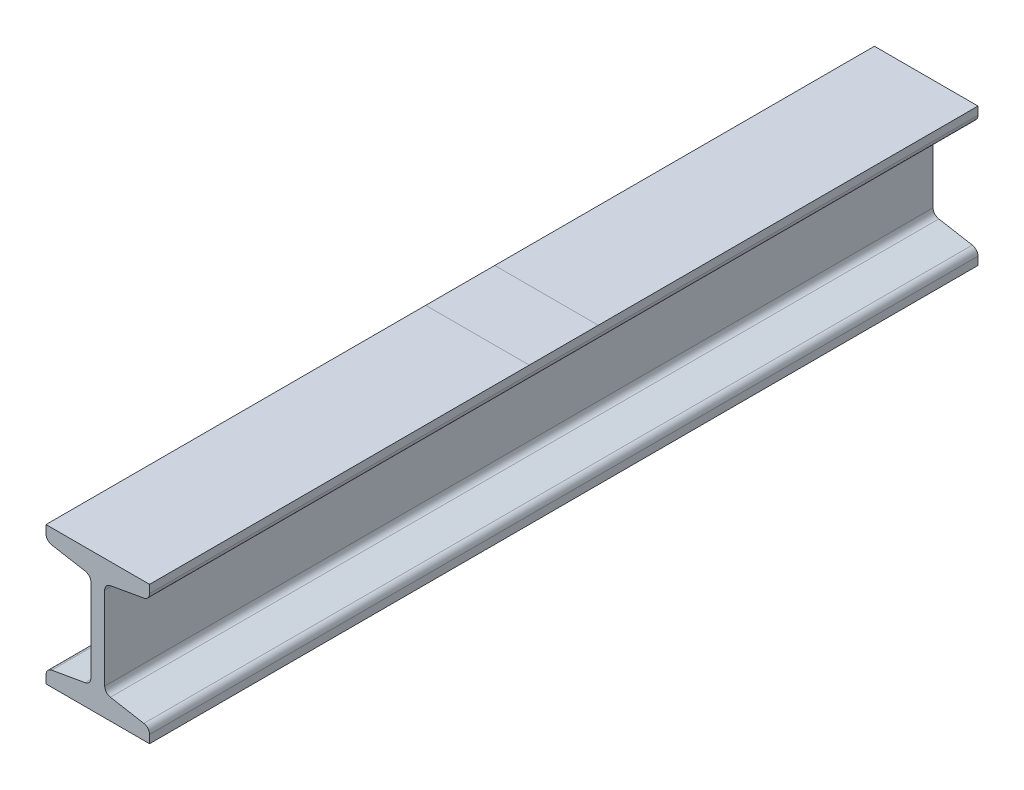
ISO-10303-21;
HEADER;
FILE_DESCRIPTION(('STEP AP214'),'2;1');
FILE_NAME('part.step','',(''),(''),'','','');
FILE_SCHEMA(('AUTOMOTIVE_DESIGN { 1 0 10303 214 1 1 1 1 }'));
ENDSEC;
DATA;
#1=APPLICATION_CONTEXT('core data for automotive mechanical design processes');
#2=APPLICATION_PROTOCOL_DEFINITION('international standard','automotive_design',2000,#1);
#3=PRODUCT_CONTEXT('',#1,'mechanical');
#4=PRODUCT('Part','Part','',(#3));
#5=PRODUCT_RELATED_PRODUCT_CATEGORY('part','',(#4));
#6=PRODUCT_DEFINITION_FORMATION('','',#4);
#7=PRODUCT_DEFINITION_CONTEXT('part definition',#1,'design');
#8=PRODUCT_DEFINITION('design','',#6,#7);
#9=PRODUCT_DEFINITION_SHAPE('','',#8);
#10=(LENGTH_UNIT() NAMED_UNIT(*) SI_UNIT(.MILLI.,.METRE.));
#11=(NAMED_UNIT(*) PLANE_ANGLE_UNIT() SI_UNIT($,.RADIAN.));
#12=(NAMED_UNIT(*) SI_UNIT($,.STERADIAN.) SOLID_ANGLE_UNIT());
#13=UNCERTAINTY_MEASURE_WITH_UNIT(LENGTH_MEASURE(1.E-05),#10,'distance_accuracy_value','');
#14=(GEOMETRIC_REPRESENTATION_CONTEXT(3) GLOBAL_UNCERTAINTY_ASSIGNED_CONTEXT((#13)) GLOBAL_UNIT_ASSIGNED_CONTEXT((#10,
#11,#12)) REPRESENTATION_CONTEXT('',''));
#15=CARTESIAN_POINT('',(0.,0.,0.));
#16=DIRECTION('',(0.,0.,1.));
#17=DIRECTION('',(1.,0.,0.));
#18=AXIS2_PLACEMENT_3D('',#15,#16,#17);
#19=CARTESIAN_POINT('',(-37.5,-50.,600.));
#20=DIRECTION('',(0.,1.,0.));
#21=DIRECTION('',(0.,0.,1.));
#22=AXIS2_PLACEMENT_3D('',#19,#20,#21);
#23=PLANE('',#22);
#24=DIRECTION('',(-1.,0.,0.));
#25=VECTOR('',#24,1.);
#26=CARTESIAN_POINT('',(-37.5000000000003,-50.,40.));
#27=LINE('',#26,#25);
#28=CARTESIAN_POINT('',(37.5,-50.,40.));
#29=VERTEX_POINT('',#28);
#30=CARTESIAN_POINT('',(-37.5,-50.,40.));
#31=VERTEX_POINT('',#30);
#32=EDGE_CURVE('E278',#29,#31,#27,.T.);
#33=ORIENTED_EDGE('',*,*,#32,.F.);
#34=DIRECTION('',(0.,0.,-1.));
#35=VECTOR('',#34,1.);
#36=CARTESIAN_POINT('',(37.5,-50.,600.));
#37=LINE('',#36,#35);
#38=CARTESIAN_POINT('',(37.5,-50.,560.));
#39=VERTEX_POINT('',#38);
#40=EDGE_CURVE('E517',#39,#29,#37,.T.);
#41=ORIENTED_EDGE('',*,*,#40,.F.);
#42=DIRECTION('',(1.,0.,0.));
#43=VECTOR('',#42,1.);
#44=CARTESIAN_POINT('',(-37.5,-50.,560.));
#45=LINE('',#44,#43);
#46=CARTESIAN_POINT('',(-37.5,-50.,560.));
#47=VERTEX_POINT('',#46);
#48=EDGE_CURVE('E284',#47,#39,#45,.T.);
#49=ORIENTED_EDGE('',*,*,#48,.F.);
#50=DIRECTION('',(0.,0.,-1.));
#51=VECTOR('',#50,1.);
#52=CARTESIAN_POINT('',(-37.5,-50.,600.));
#53=LINE('',#52,#51);
#54=EDGE_CURVE('E357',#47,#31,#53,.T.);
#55=ORIENTED_EDGE('',*,*,#54,.T.);
#56=EDGE_LOOP('',(#33,#41,#49,#55));
#57=FACE_BOUND('',#56,.T.);
#58=ADVANCED_FACE('F52',(#57),#23,.F.);
#59=CARTESIAN_POINT('',(37.5,-50.,0.));
#60=VERTEX_POINT('',#59);
#61=EDGE_CURVE('E521',#29,#60,#37,.T.);
#62=ORIENTED_EDGE('',*,*,#61,.F.);
#63=ORIENTED_EDGE('',*,*,#32,.T.);
#64=CARTESIAN_POINT('',(-37.5,-50.,0.));
#65=VERTEX_POINT('',#64);
#66=EDGE_CURVE('E358',#31,#65,#53,.T.);
#67=ORIENTED_EDGE('',*,*,#66,.T.);
#68=DIRECTION('',(1.,0.,0.));
#69=VECTOR('',#68,1.);
#70=CARTESIAN_POINT('',(-37.5,-50.,0.));
#71=LINE('',#70,#69);
#72=EDGE_CURVE('E382',#65,#60,#71,.T.);
#73=ORIENTED_EDGE('',*,*,#72,.T.);
#74=EDGE_LOOP('',(#62,#63,#67,#73));
#75=FACE_BOUND('',#74,.T.);
#76=ADVANCED_FACE('F570',(#75),#23,.F.);
#77=CARTESIAN_POINT('',(-37.5,50.,600.));
#78=DIRECTION('',(0.,-1.,0.));
#79=DIRECTION('',(0.,0.,-1.));
#80=AXIS2_PLACEMENT_3D('',#77,#78,#79);
#81=PLANE('',#80);
#82=DIRECTION('',(-1.,0.,0.));
#83=VECTOR('',#82,1.);
#84=CARTESIAN_POINT('',(-37.5,50.,275.));
#85=LINE('',#84,#83);
#86=CARTESIAN_POINT('',(37.5,50.,275.));
#87=VERTEX_POINT('',#86);
#88=CARTESIAN_POINT('',(-37.5,50.,275.));
#89=VERTEX_POINT('',#88);
#90=EDGE_CURVE('E493',#87,#89,#85,.T.);
#91=ORIENTED_EDGE('',*,*,#90,.F.);
#92=DIRECTION('',(0.,0.,-1.));
#93=VECTOR('',#92,1.);
#94=CARTESIAN_POINT('',(37.5,50.,600.));
#95=LINE('',#94,#93);
#96=CARTESIAN_POINT('',(37.5,50.,0.));
#97=VERTEX_POINT('',#96);
#98=EDGE_CURVE('E241',#87,#97,#95,.T.);
#99=ORIENTED_EDGE('',*,*,#98,.T.);
#100=DIRECTION('',(-1.,0.,0.));
#101=VECTOR('',#100,1.);
#102=CARTESIAN_POINT('',(-37.5,50.,0.));
#103=LINE('',#102,#101);
#104=CARTESIAN_POINT('',(-37.5,50.,0.));
#105=VERTEX_POINT('',#104);
#106=EDGE_CURVE('E418',#97,#105,#103,.T.);
#107=ORIENTED_EDGE('',*,*,#106,.T.);
#108=DIRECTION('',(0.,0.,-1.));
#109=VECTOR('',#108,1.);
#110=CARTESIAN_POINT('',(-37.5,50.,600.));
#111=LINE('',#110,#109);
#112=EDGE_CURVE('E356',#89,#105,#111,.T.);
#113=ORIENTED_EDGE('',*,*,#112,.F.);
#114=EDGE_LOOP('',(#91,#99,#107,#113));
#115=FACE_BOUND('',#114,.T.);
#116=ADVANCED_FACE('F492',(#115),#81,.F.);
#117=DIRECTION('',(1.,0.,0.));
#118=VECTOR('',#117,1.);
#119=CARTESIAN_POINT('',(-37.5,50.,325.));
#120=LINE('',#119,#118);
#121=CARTESIAN_POINT('',(-37.5,50.,325.));
#122=VERTEX_POINT('',#121);
#123=CARTESIAN_POINT('',(37.5,50.,325.));
#124=VERTEX_POINT('',#123);
#125=EDGE_CURVE('E239',#122,#124,#120,.T.);
#126=ORIENTED_EDGE('',*,*,#125,.F.);
#127=CARTESIAN_POINT('',(-37.5,50.,600.));
#128=VERTEX_POINT('',#127);
#129=EDGE_CURVE('E244',#128,#122,#111,.T.);
#130=ORIENTED_EDGE('',*,*,#129,.F.);
#131=DIRECTION('',(-1.,0.,0.));
#132=VECTOR('',#131,1.);
#133=CARTESIAN_POINT('',(-37.5,50.,600.));
#134=LINE('',#133,#132);
#135=CARTESIAN_POINT('',(37.5,50.,600.));
#136=VERTEX_POINT('',#135);
#137=EDGE_CURVE('E219',#136,#128,#134,.T.);
#138=ORIENTED_EDGE('',*,*,#137,.F.);
#139=EDGE_CURVE('E232',#136,#124,#95,.T.);
#140=ORIENTED_EDGE('',*,*,#139,.T.);
#141=EDGE_LOOP('',(#126,#130,#138,#140));
#142=FACE_BOUND('',#141,.T.);
#143=ADVANCED_FACE('F242',(#142),#81,.F.);
#144=CARTESIAN_POINT('',(37.5,40.,600.));
#145=DIRECTION('',(-0.173648177666934,0.984807753012207,0.));
#146=DIRECTION('',(-0.984807753012208,-0.173648177666934,0.));
#147=AXIS2_PLACEMENT_3D('',#144,#145,#146);
#148=PLANE('',#147);
#149=DIRECTION('',(0.984807753012207,0.173648177666934,0.));
#150=VECTOR('',#149,1.);
#151=CARTESIAN_POINT('',(37.5,40.,0.));
#152=LINE('',#151,#150);
#153=CARTESIAN_POINT('',(9.13175911166535,34.9979137361494,0.));
#154=VERTEX_POINT('',#153);
#155=CARTESIAN_POINT('',(33.3682408883347,39.2714593908254,0.));
#156=VERTEX_POINT('',#155);
#157=EDGE_CURVE('E420',#154,#156,#152,.T.);
#158=ORIENTED_EDGE('',*,*,#157,.T.);
#159=DIRECTION('',(0.,0.,-1.));
#160=VECTOR('',#159,1.);
#161=CARTESIAN_POINT('',(33.3682408883347,39.2714593908254,600.));
#162=LINE('',#161,#160);
#163=CARTESIAN_POINT('',(33.3682408883347,39.2714593908254,600.));
#164=VERTEX_POINT('',#163);
#165=EDGE_CURVE('E325',#156,#164,#162,.F.);
#166=ORIENTED_EDGE('',*,*,#165,.T.);
#167=DIRECTION('',(0.984807753012207,0.173648177666934,0.));
#168=VECTOR('',#167,1.);
#169=CARTESIAN_POINT('',(37.5,40.,600.));
#170=LINE('',#169,#168);
#171=CARTESIAN_POINT('',(9.13175911166535,34.9979137361494,600.));
#172=VERTEX_POINT('',#171);
#173=EDGE_CURVE('E228',#172,#164,#170,.T.);
#174=ORIENTED_EDGE('',*,*,#173,.F.);
#175=DIRECTION('',(0.,0.,-1.));
#176=VECTOR('',#175,1.);
#177=CARTESIAN_POINT('',(9.13175911166535,34.9979137361494,0.));
#178=LINE('',#177,#176);
#179=EDGE_CURVE('E321',#172,#154,#178,.T.);
#180=ORIENTED_EDGE('',*,*,#179,.T.);
#181=EDGE_LOOP('',(#158,#166,#174,#180));
#182=FACE_BOUND('',#181,.T.);
#183=ADVANCED_FACE('F600',(#182),#148,.F.);
#184=CARTESIAN_POINT('',(37.5,50.,600.));
#185=DIRECTION('',(-1.,0.,0.));
#186=DIRECTION('',(0.,-1.,0.));
#187=AXIS2_PLACEMENT_3D('',#184,#185,#186);
#188=PLANE('',#187);
#189=DIRECTION('',(0.,1.,0.));
#190=VECTOR('',#189,1.);
#191=CARTESIAN_POINT('',(37.5,50.,600.));
#192=LINE('',#191,#190);
#193=CARTESIAN_POINT('',(37.5,44.1954981558864,600.));
#194=VERTEX_POINT('',#193);
#195=EDGE_CURVE('E213',#194,#136,#192,.T.);
#196=ORIENTED_EDGE('',*,*,#195,.F.);
#197=DIRECTION('',(0.,0.,-1.));
#198=VECTOR('',#197,1.);
#199=CARTESIAN_POINT('',(37.5,44.1954981558864,600.));
#200=LINE('',#199,#198);
#201=CARTESIAN_POINT('',(37.5,44.1954981558864,0.));
#202=VERTEX_POINT('',#201);
#203=EDGE_CURVE('E318',#194,#202,#200,.T.);
#204=ORIENTED_EDGE('',*,*,#203,.T.);
#205=DIRECTION('',(0.,1.,0.));
#206=VECTOR('',#205,1.);
#207=CARTESIAN_POINT('',(37.5,50.,0.));
#208=LINE('',#207,#206);
#209=EDGE_CURVE('E408',#202,#97,#208,.T.);
#210=ORIENTED_EDGE('',*,*,#209,.T.);
#211=ORIENTED_EDGE('',*,*,#98,.F.);
#212=EDGE_CURVE('E236',#124,#87,#95,.T.);
#213=ORIENTED_EDGE('',*,*,#212,.F.);
#214=ORIENTED_EDGE('',*,*,#139,.F.);
#215=EDGE_LOOP('',(#196,#204,#210,#211,#213,#214));
#216=FACE_BOUND('',#215,.T.);
#217=ADVANCED_FACE('F233',(#216),#188,.F.);
#218=ORIENTED_EDGE('',*,*,#212,.T.);
#219=ORIENTED_EDGE('',*,*,#90,.T.);
#220=EDGE_CURVE('E364',#122,#89,#111,.T.);
#221=ORIENTED_EDGE('',*,*,#220,.F.);
#222=ORIENTED_EDGE('',*,*,#125,.T.);
#223=EDGE_LOOP('',(#218,#219,#221,#222));
#224=FACE_BOUND('',#223,.T.);
#225=ADVANCED_FACE('F497',(#224),#81,.F.);
#226=CARTESIAN_POINT('',(-37.5,50.,600.));
#227=DIRECTION('',(1.,0.,0.));
#228=DIRECTION('',(0.,0.,-1.));
#229=AXIS2_PLACEMENT_3D('',#226,#227,#228);
#230=PLANE('',#229);
#231=DIRECTION('',(0.,-1.,0.));
#232=VECTOR('',#231,1.);
#233=CARTESIAN_POINT('',(-37.5,50.,0.));
#234=LINE('',#233,#232);
#235=CARTESIAN_POINT('',(-37.5,44.1954981558864,0.));
#236=VERTEX_POINT('',#235);
#237=EDGE_CURVE('E424',#105,#236,#234,.T.);
#238=ORIENTED_EDGE('',*,*,#237,.T.);
#239=DIRECTION('',(0.,0.,-1.));
#240=VECTOR('',#239,1.);
#241=CARTESIAN_POINT('',(-37.5,44.1954981558864,600.));
#242=LINE('',#241,#240);
#243=CARTESIAN_POINT('',(-37.5,44.1954981558864,600.));
#244=VERTEX_POINT('',#243);
#245=EDGE_CURVE('E335',#236,#244,#242,.F.);
#246=ORIENTED_EDGE('',*,*,#245,.T.);
#247=DIRECTION('',(0.,-1.,0.));
#248=VECTOR('',#247,1.);
#249=CARTESIAN_POINT('',(-37.5,50.,600.));
#250=LINE('',#249,#248);
#251=EDGE_CURVE('E247',#128,#244,#250,.T.);
#252=ORIENTED_EDGE('',*,*,#251,.F.);
#253=ORIENTED_EDGE('',*,*,#129,.T.);
#254=ORIENTED_EDGE('',*,*,#220,.T.);
#255=ORIENTED_EDGE('',*,*,#112,.T.);
#256=EDGE_LOOP('',(#238,#246,#252,#253,#254,#255));
#257=FACE_BOUND('',#256,.T.);
#258=ADVANCED_FACE('F486',(#257),#230,.F.);
#259=CARTESIAN_POINT('',(-37.5,40.,600.));
#260=DIRECTION('',(0.173648177666934,0.984807753012207,0.));
#261=DIRECTION('',(-0.984807753012208,0.173648177666934,0.));
#262=AXIS2_PLACEMENT_3D('',#259,#260,#261);
#263=PLANE('',#262);
#264=DIRECTION('',(0.984807753012207,-0.173648177666934,0.));
#265=VECTOR('',#264,1.);
#266=CARTESIAN_POINT('',(-37.5,40.,600.));
#267=LINE('',#266,#265);
#268=CARTESIAN_POINT('',(-33.3682408883347,39.2714593908254,600.));
#269=VERTEX_POINT('',#268);
#270=CARTESIAN_POINT('',(-9.13175911166534,34.9979137361494,600.));
#271=VERTEX_POINT('',#270);
#272=EDGE_CURVE('E250',#269,#271,#267,.T.);
#273=ORIENTED_EDGE('',*,*,#272,.F.);
#274=DIRECTION('',(0.,0.,-1.));
#275=VECTOR('',#274,1.);
#276=CARTESIAN_POINT('',(-33.3682408883347,39.2714593908254,600.));
#277=LINE('',#276,#275);
#278=CARTESIAN_POINT('',(-33.3682408883347,39.2714593908254,0.));
#279=VERTEX_POINT('',#278);
#280=EDGE_CURVE('E331',#269,#279,#277,.T.);
#281=ORIENTED_EDGE('',*,*,#280,.T.);
#282=DIRECTION('',(0.984807753012207,-0.173648177666934,0.));
#283=VECTOR('',#282,1.);
#284=CARTESIAN_POINT('',(-37.5,40.,0.));
#285=LINE('',#284,#283);
#286=CARTESIAN_POINT('',(-9.13175911166534,34.9979137361494,0.));
#287=VERTEX_POINT('',#286);
#288=EDGE_CURVE('E431',#279,#287,#285,.T.);
#289=ORIENTED_EDGE('',*,*,#288,.T.);
#290=DIRECTION('',(0.,0.,-1.));
#291=VECTOR('',#290,1.);
#292=CARTESIAN_POINT('',(-9.13175911166534,34.9979137361494,600.));
#293=LINE('',#292,#291);
#294=EDGE_CURVE('E328',#287,#271,#293,.F.);
#295=ORIENTED_EDGE('',*,*,#294,.T.);
#296=EDGE_LOOP('',(#273,#281,#289,#295));
#297=FACE_BOUND('',#296,.T.);
#298=ADVANCED_FACE('F479',(#297),#263,.F.);
#299=CARTESIAN_POINT('',(-4.99999999999998,-34.2693731269748,600.));
#300=DIRECTION('',(1.,0.,0.));
#301=DIRECTION('',(0.,1.,0.));
#302=AXIS2_PLACEMENT_3D('',#299,#300,#301);
#303=PLANE('',#302);
#304=DIRECTION('',(0.,-1.,0.));
#305=VECTOR('',#304,1.);
#306=CARTESIAN_POINT('',(-4.99999999999998,-34.2693731269748,0.));
#307=LINE('',#306,#305);
#308=CARTESIAN_POINT('',(-5.,30.0738749710884,0.));
#309=VERTEX_POINT('',#308);
#310=CARTESIAN_POINT('',(-4.99999999999998,-30.0738749710884,0.));
#311=VERTEX_POINT('',#310);
#312=EDGE_CURVE('E378',#309,#311,#307,.T.);
#313=ORIENTED_EDGE('',*,*,#312,.T.);
#314=DIRECTION('',(0.,0.,-1.));
#315=VECTOR('',#314,1.);
#316=CARTESIAN_POINT('',(-4.99999999999998,-30.0738749710884,600.));
#317=LINE('',#316,#315);
#318=CARTESIAN_POINT('',(-4.99999999999998,-30.0738749710884,600.));
#319=VERTEX_POINT('',#318);
#320=EDGE_CURVE('E445',#311,#319,#317,.F.);
#321=ORIENTED_EDGE('',*,*,#320,.T.);
#322=DIRECTION('',(0.,-1.,0.));
#323=VECTOR('',#322,1.);
#324=CARTESIAN_POINT('',(-4.99999999999998,-34.2693731269748,600.));
#325=LINE('',#324,#323);
#326=CARTESIAN_POINT('',(-5.,30.0738749710884,600.));
#327=VERTEX_POINT('',#326);
#328=EDGE_CURVE('E257',#327,#319,#325,.T.);
#329=ORIENTED_EDGE('',*,*,#328,.F.);
#330=DIRECTION('',(0.,0.,-1.));
#331=VECTOR('',#330,1.);
#332=CARTESIAN_POINT('',(-5.,30.0738749710884,0.));
#333=LINE('',#332,#331);
#334=EDGE_CURVE('E447',#327,#309,#333,.T.);
#335=ORIENTED_EDGE('',*,*,#334,.T.);
#336=EDGE_LOOP('',(#313,#321,#329,#335));
#337=FACE_BOUND('',#336,.T.);
#338=ADVANCED_FACE('F443',(#337),#303,.F.);
#339=CARTESIAN_POINT('',(-37.5,-40.,600.));
#340=DIRECTION('',(0.173648177666934,-0.984807753012207,0.));
#341=DIRECTION('',(0.984807753012208,0.173648177666934,0.));
#342=AXIS2_PLACEMENT_3D('',#339,#340,#341);
#343=PLANE('',#342);
#344=DIRECTION('',(-0.984807753012207,-0.173648177666934,0.));
#345=VECTOR('',#344,1.);
#346=CARTESIAN_POINT('',(-37.5,-40.,0.));
#347=LINE('',#346,#345);
#348=CARTESIAN_POINT('',(-9.13175911166532,-34.9979137361494,0.));
#349=VERTEX_POINT('',#348);
#350=CARTESIAN_POINT('',(-33.3682408883347,-39.2714593908254,0.));
#351=VERTEX_POINT('',#350);
#352=EDGE_CURVE('E371',#349,#351,#347,.T.);
#353=ORIENTED_EDGE('',*,*,#352,.T.);
#354=DIRECTION('',(0.,0.,-1.));
#355=VECTOR('',#354,1.);
#356=CARTESIAN_POINT('',(-33.3682408883347,-39.2714593908254,600.));
#357=LINE('',#356,#355);
#358=CARTESIAN_POINT('',(-33.3682408883347,-39.2714593908254,600.));
#359=VERTEX_POINT('',#358);
#360=EDGE_CURVE('E548',#351,#359,#357,.F.);
#361=ORIENTED_EDGE('',*,*,#360,.T.);
#362=DIRECTION('',(-0.984807753012207,-0.173648177666934,0.));
#363=VECTOR('',#362,1.);
#364=CARTESIAN_POINT('',(-37.5,-40.,600.));
#365=LINE('',#364,#363);
#366=CARTESIAN_POINT('',(-9.13175911166532,-34.9979137361494,600.));
#367=VERTEX_POINT('',#366);
#368=EDGE_CURVE('E261',#367,#359,#365,.T.);
#369=ORIENTED_EDGE('',*,*,#368,.F.);
#370=DIRECTION('',(0.,0.,-1.));
#371=VECTOR('',#370,1.);
#372=CARTESIAN_POINT('',(-9.13175911166532,-34.9979137361494,0.));
#373=LINE('',#372,#371);
#374=EDGE_CURVE('E343',#367,#349,#373,.T.);
#375=ORIENTED_EDGE('',*,*,#374,.T.);
#376=EDGE_LOOP('',(#353,#361,#369,#375));
#377=FACE_BOUND('',#376,.T.);
#378=ADVANCED_FACE('F556',(#377),#343,.F.);
#379=CARTESIAN_POINT('',(-37.5,-50.,600.));
#380=DIRECTION('',(1.,0.,0.));
#381=DIRECTION('',(0.,1.,0.));
#382=AXIS2_PLACEMENT_3D('',#379,#380,#381);
#383=PLANE('',#382);
#384=DIRECTION('',(0.,-1.,0.));
#385=VECTOR('',#384,1.);
#386=CARTESIAN_POINT('',(-37.5,-50.,600.));
#387=LINE('',#386,#385);
#388=CARTESIAN_POINT('',(-37.5,-44.1954981558864,600.));
#389=VERTEX_POINT('',#388);
#390=CARTESIAN_POINT('',(-37.5,-50.,600.));
#391=VERTEX_POINT('',#390);
#392=EDGE_CURVE('E265',#389,#391,#387,.T.);
#393=ORIENTED_EDGE('',*,*,#392,.F.);
#394=DIRECTION('',(0.,0.,-1.));
#395=VECTOR('',#394,1.);
#396=CARTESIAN_POINT('',(-37.5,-44.1954981558864,600.));
#397=LINE('',#396,#395);
#398=CARTESIAN_POINT('',(-37.5,-44.1954981558864,0.));
#399=VERTEX_POINT('',#398);
#400=EDGE_CURVE('E338',#389,#399,#397,.T.);
#401=ORIENTED_EDGE('',*,*,#400,.T.);
#402=DIRECTION('',(0.,-1.,0.));
#403=VECTOR('',#402,1.);
#404=CARTESIAN_POINT('',(-37.5,-50.,0.));
#405=LINE('',#404,#403);
#406=EDGE_CURVE('E377',#399,#65,#405,.T.);
#407=ORIENTED_EDGE('',*,*,#406,.T.);
#408=ORIENTED_EDGE('',*,*,#66,.F.);
#409=ORIENTED_EDGE('',*,*,#54,.F.);
#410=EDGE_CURVE('E351',#391,#47,#53,.T.);
#411=ORIENTED_EDGE('',*,*,#410,.F.);
#412=EDGE_LOOP('',(#393,#401,#407,#408,#409,#411));
#413=FACE_BOUND('',#412,.T.);
#414=ADVANCED_FACE('F565',(#413),#383,.F.);
#415=ORIENTED_EDGE('',*,*,#410,.T.);
#416=ORIENTED_EDGE('',*,*,#48,.T.);
#417=CARTESIAN_POINT('',(37.5,-50.,600.));
#418=VERTEX_POINT('',#417);
#419=EDGE_CURVE('E359',#418,#39,#37,.T.);
#420=ORIENTED_EDGE('',*,*,#419,.F.);
#421=DIRECTION('',(1.,0.,0.));
#422=VECTOR('',#421,1.);
#423=CARTESIAN_POINT('',(-37.5,-50.,600.));
#424=LINE('',#423,#422);
#425=EDGE_CURVE('E268',#391,#418,#424,.T.);
#426=ORIENTED_EDGE('',*,*,#425,.F.);
#427=EDGE_LOOP('',(#415,#416,#420,#426));
#428=FACE_BOUND('',#427,.T.);
#429=ADVANCED_FACE('F508',(#428),#23,.F.);
#430=CARTESIAN_POINT('',(37.5,-50.,600.));
#431=DIRECTION('',(-1.,0.,0.));
#432=DIRECTION('',(0.,-1.,0.));
#433=AXIS2_PLACEMENT_3D('',#430,#431,#432);
#434=PLANE('',#433);
#435=DIRECTION('',(0.,1.,0.));
#436=VECTOR('',#435,1.);
#437=CARTESIAN_POINT('',(37.5,-50.,0.));
#438=LINE('',#437,#436);
#439=CARTESIAN_POINT('',(37.5,-44.1954981558864,0.));
#440=VERTEX_POINT('',#439);
#441=EDGE_CURVE('E387',#60,#440,#438,.T.);
#442=ORIENTED_EDGE('',*,*,#441,.T.);
#443=DIRECTION('',(0.,0.,-1.));
#444=VECTOR('',#443,1.);
#445=CARTESIAN_POINT('',(37.5,-44.1954981558864,600.));
#446=LINE('',#445,#444);
#447=CARTESIAN_POINT('',(37.5,-44.1954981558864,600.));
#448=VERTEX_POINT('',#447);
#449=EDGE_CURVE('E304',#440,#448,#446,.F.);
#450=ORIENTED_EDGE('',*,*,#449,.T.);
#451=DIRECTION('',(0.,1.,0.));
#452=VECTOR('',#451,1.);
#453=CARTESIAN_POINT('',(37.5,-50.,600.));
#454=LINE('',#453,#452);
#455=EDGE_CURVE('E272',#418,#448,#454,.T.);
#456=ORIENTED_EDGE('',*,*,#455,.F.);
#457=ORIENTED_EDGE('',*,*,#419,.T.);
#458=ORIENTED_EDGE('',*,*,#40,.T.);
#459=ORIENTED_EDGE('',*,*,#61,.T.);
#460=EDGE_LOOP('',(#442,#450,#456,#457,#458,#459));
#461=FACE_BOUND('',#460,.T.);
#462=ADVANCED_FACE('F522',(#461),#434,.F.);
#463=CARTESIAN_POINT('',(37.5,-40.,600.));
#464=DIRECTION('',(-0.173648177666934,-0.984807753012207,0.));
#465=DIRECTION('',(0.984807753012208,-0.173648177666934,0.));
#466=AXIS2_PLACEMENT_3D('',#463,#464,#465);
#467=PLANE('',#466);
#468=DIRECTION('',(-0.984807753012207,0.173648177666934,0.));
#469=VECTOR('',#468,1.);
#470=CARTESIAN_POINT('',(37.5,-40.,600.));
#471=LINE('',#470,#469);
#472=CARTESIAN_POINT('',(33.3682408883347,-39.2714593908254,600.));
#473=VERTEX_POINT('',#472);
#474=CARTESIAN_POINT('',(9.13175911166534,-34.9979137361494,600.));
#475=VERTEX_POINT('',#474);
#476=EDGE_CURVE('E529',#473,#475,#471,.T.);
#477=ORIENTED_EDGE('',*,*,#476,.F.);
#478=DIRECTION('',(0.,0.,-1.));
#479=VECTOR('',#478,1.);
#480=CARTESIAN_POINT('',(33.3682408883347,-39.2714593908254,600.));
#481=LINE('',#480,#479);
#482=CARTESIAN_POINT('',(33.3682408883347,-39.2714593908254,0.));
#483=VERTEX_POINT('',#482);
#484=EDGE_CURVE('E288',#473,#483,#481,.T.);
#485=ORIENTED_EDGE('',*,*,#484,.T.);
#486=DIRECTION('',(-0.984807753012207,0.173648177666934,0.));
#487=VECTOR('',#486,1.);
#488=CARTESIAN_POINT('',(37.5,-40.,0.));
#489=LINE('',#488,#487);
#490=CARTESIAN_POINT('',(9.13175911166534,-34.9979137361494,0.));
#491=VERTEX_POINT('',#490);
#492=EDGE_CURVE('E391',#483,#491,#489,.T.);
#493=ORIENTED_EDGE('',*,*,#492,.T.);
#494=DIRECTION('',(0.,0.,-1.));
#495=VECTOR('',#494,1.);
#496=CARTESIAN_POINT('',(9.13175911166534,-34.9979137361494,600.));
#497=LINE('',#496,#495);
#498=EDGE_CURVE('E283',#491,#475,#497,.F.);
#499=ORIENTED_EDGE('',*,*,#498,.T.);
#500=EDGE_LOOP('',(#477,#485,#493,#499));
#501=FACE_BOUND('',#500,.T.);
#502=ADVANCED_FACE('F539',(#501),#467,.F.);
#503=CARTESIAN_POINT('',(5.00000000000001,-34.2693731269748,600.));
#504=DIRECTION('',(-1.,0.,0.));
#505=DIRECTION('',(0.,-1.,0.));
#506=AXIS2_PLACEMENT_3D('',#503,#504,#505);
#507=PLANE('',#506);
#508=DIRECTION('',(0.,1.,0.));
#509=VECTOR('',#508,1.);
#510=CARTESIAN_POINT('',(5.00000000000001,-34.2693731269748,600.));
#511=LINE('',#510,#509);
#512=CARTESIAN_POINT('',(5.00000000000001,-30.0738749710884,600.));
#513=VERTEX_POINT('',#512);
#514=CARTESIAN_POINT('',(5.00000000000002,30.0738749710884,600.));
#515=VERTEX_POINT('',#514);
#516=EDGE_CURVE('E527',#513,#515,#511,.T.);
#517=ORIENTED_EDGE('',*,*,#516,.F.);
#518=DIRECTION('',(0.,0.,-1.));
#519=VECTOR('',#518,1.);
#520=CARTESIAN_POINT('',(5.00000000000001,-30.0738749710884,0.));
#521=LINE('',#520,#519);
#522=CARTESIAN_POINT('',(5.00000000000001,-30.0738749710884,0.));
#523=VERTEX_POINT('',#522);
#524=EDGE_CURVE('E461',#513,#523,#521,.T.);
#525=ORIENTED_EDGE('',*,*,#524,.T.);
#526=DIRECTION('',(0.,1.,0.));
#527=VECTOR('',#526,1.);
#528=CARTESIAN_POINT('',(5.00000000000001,-34.2693731269748,0.));
#529=LINE('',#528,#527);
#530=CARTESIAN_POINT('',(5.00000000000002,30.0738749710884,0.));
#531=VERTEX_POINT('',#530);
#532=EDGE_CURVE('E394',#523,#531,#529,.T.);
#533=ORIENTED_EDGE('',*,*,#532,.T.);
#534=DIRECTION('',(0.,0.,-1.));
#535=VECTOR('',#534,1.);
#536=CARTESIAN_POINT('',(5.00000000000002,30.0738749710884,600.));
#537=LINE('',#536,#535);
#538=EDGE_CURVE('E68',#531,#515,#537,.F.);
#539=ORIENTED_EDGE('',*,*,#538,.T.);
#540=EDGE_LOOP('',(#517,#525,#533,#539));
#541=FACE_BOUND('',#540,.T.);
#542=ADVANCED_FACE('F545',(#541),#507,.F.);
#543=CARTESIAN_POINT('',(0.,0.,600.));
#544=DIRECTION('',(0.,0.,-1.));
#545=DIRECTION('',(-1.,0.,0.));
#546=AXIS2_PLACEMENT_3D('',#543,#544,#545);
#547=PLANE('',#546);
#548=ORIENTED_EDGE('',*,*,#455,.T.);
#549=CARTESIAN_POINT('',(32.5,-44.1954981558864,600.));
#550=DIRECTION('',(0.,0.,-1.));
#551=DIRECTION('',(-1.,0.,0.));
#552=AXIS2_PLACEMENT_3D('',#549,#550,#551);
#553=CIRCLE('',#552,5.);
#554=EDGE_CURVE('E315',#448,#473,#553,.F.);
#555=ORIENTED_EDGE('',*,*,#554,.T.);
#556=ORIENTED_EDGE('',*,*,#476,.T.);
#557=CARTESIAN_POINT('',(10.,-30.0738749710884,600.));
#558=DIRECTION('',(0.,0.,-1.));
#559=DIRECTION('',(-1.,0.,0.));
#560=AXIS2_PLACEMENT_3D('',#557,#558,#559);
#561=CIRCLE('',#560,5.);
#562=EDGE_CURVE('E75',#475,#513,#561,.T.);
#563=ORIENTED_EDGE('',*,*,#562,.T.);
#564=ORIENTED_EDGE('',*,*,#516,.T.);
#565=CARTESIAN_POINT('',(10.,30.0738749710884,600.));
#566=DIRECTION('',(0.,0.,-1.));
#567=DIRECTION('',(-1.,0.,0.));
#568=AXIS2_PLACEMENT_3D('',#565,#566,#567);
#569=CIRCLE('',#568,5.);
#570=EDGE_CURVE('E401',#515,#172,#569,.T.);
#571=ORIENTED_EDGE('',*,*,#570,.T.);
#572=ORIENTED_EDGE('',*,*,#173,.T.);
#573=CARTESIAN_POINT('',(32.5,44.1954981558864,600.));
#574=DIRECTION('',(0.,0.,-1.));
#575=DIRECTION('',(-1.,0.,0.));
#576=AXIS2_PLACEMENT_3D('',#573,#574,#575);
#577=CIRCLE('',#576,5.);
#578=EDGE_CURVE('E223',#164,#194,#577,.F.);
#579=ORIENTED_EDGE('',*,*,#578,.T.);
#580=ORIENTED_EDGE('',*,*,#195,.T.);
#581=ORIENTED_EDGE('',*,*,#137,.T.);
#582=ORIENTED_EDGE('',*,*,#251,.T.);
#583=CARTESIAN_POINT('',(-32.5,44.1954981558864,600.));
#584=DIRECTION('',(0.,0.,-1.));
#585=DIRECTION('',(-1.,0.,0.));
#586=AXIS2_PLACEMENT_3D('',#583,#584,#585);
#587=CIRCLE('',#586,5.);
#588=EDGE_CURVE('E310',#244,#269,#587,.F.);
#589=ORIENTED_EDGE('',*,*,#588,.T.);
#590=ORIENTED_EDGE('',*,*,#272,.T.);
#591=CARTESIAN_POINT('',(-10.,30.0738749710884,600.));
#592=DIRECTION('',(0.,0.,-1.));
#593=DIRECTION('',(-1.,0.,0.));
#594=AXIS2_PLACEMENT_3D('',#591,#592,#593);
#595=CIRCLE('',#594,5.);
#596=EDGE_CURVE('E12',#271,#327,#595,.T.);
#597=ORIENTED_EDGE('',*,*,#596,.T.);
#598=ORIENTED_EDGE('',*,*,#328,.T.);
#599=CARTESIAN_POINT('',(-9.99999999999998,-30.0738749710884,600.));
#600=DIRECTION('',(0.,0.,-1.));
#601=DIRECTION('',(-1.,0.,0.));
#602=AXIS2_PLACEMENT_3D('',#599,#600,#601);
#603=CIRCLE('',#602,5.);
#604=EDGE_CURVE('E454',#319,#367,#603,.T.);
#605=ORIENTED_EDGE('',*,*,#604,.T.);
#606=ORIENTED_EDGE('',*,*,#368,.T.);
#607=CARTESIAN_POINT('',(-32.5,-44.1954981558864,600.));
#608=DIRECTION('',(0.,0.,-1.));
#609=DIRECTION('',(-1.,0.,0.));
#610=AXIS2_PLACEMENT_3D('',#607,#608,#609);
#611=CIRCLE('',#610,5.);
#612=EDGE_CURVE('E307',#359,#389,#611,.F.);
#613=ORIENTED_EDGE('',*,*,#612,.T.);
#614=ORIENTED_EDGE('',*,*,#392,.T.);
#615=ORIENTED_EDGE('',*,*,#425,.T.);
#616=EDGE_LOOP('',(#548,#555,#556,#563,#564,#571,#572,#579,#580,#581,#582,#589,#590,#597,#598,
#605,#606,#613,#614,#615));
#617=FACE_BOUND('',#616,.T.);
#618=ADVANCED_FACE('F216',(#617),#547,.F.);
#619=CARTESIAN_POINT('',(0.,0.,0.));
#620=DIRECTION('',(0.,0.,-1.));
#621=DIRECTION('',(-1.,0.,0.));
#622=AXIS2_PLACEMENT_3D('',#619,#620,#621);
#623=PLANE('',#622);
#624=ORIENTED_EDGE('',*,*,#492,.F.);
#625=CARTESIAN_POINT('',(32.5,-44.1954981558864,0.));
#626=DIRECTION('',(0.,0.,-1.));
#627=DIRECTION('',(-1.,0.,0.));
#628=AXIS2_PLACEMENT_3D('',#625,#626,#627);
#629=CIRCLE('',#628,5.);
#630=EDGE_CURVE('E301',#483,#440,#629,.T.);
#631=ORIENTED_EDGE('',*,*,#630,.T.);
#632=ORIENTED_EDGE('',*,*,#441,.F.);
#633=ORIENTED_EDGE('',*,*,#72,.F.);
#634=ORIENTED_EDGE('',*,*,#406,.F.);
#635=CARTESIAN_POINT('',(-32.5,-44.1954981558864,0.));
#636=DIRECTION('',(0.,0.,-1.));
#637=DIRECTION('',(-1.,0.,0.));
#638=AXIS2_PLACEMENT_3D('',#635,#636,#637);
#639=CIRCLE('',#638,5.);
#640=EDGE_CURVE('E292',#399,#351,#639,.T.);
#641=ORIENTED_EDGE('',*,*,#640,.T.);
#642=ORIENTED_EDGE('',*,*,#352,.F.);
#643=CARTESIAN_POINT('',(-9.99999999999998,-30.0738749710884,0.));
#644=DIRECTION('',(0.,0.,-1.));
#645=DIRECTION('',(-1.,0.,0.));
#646=AXIS2_PLACEMENT_3D('',#643,#644,#645);
#647=CIRCLE('',#646,5.);
#648=EDGE_CURVE('E452',#349,#311,#647,.F.);
#649=ORIENTED_EDGE('',*,*,#648,.T.);
#650=ORIENTED_EDGE('',*,*,#312,.F.);
#651=CARTESIAN_POINT('',(-10.,30.0738749710884,0.));
#652=DIRECTION('',(0.,0.,-1.));
#653=DIRECTION('',(-1.,0.,0.));
#654=AXIS2_PLACEMENT_3D('',#651,#652,#653);
#655=CIRCLE('',#654,5.);
#656=EDGE_CURVE('E61',#309,#287,#655,.F.);
#657=ORIENTED_EDGE('',*,*,#656,.T.);
#658=ORIENTED_EDGE('',*,*,#288,.F.);
#659=CARTESIAN_POINT('',(-32.5,44.1954981558864,0.));
#660=DIRECTION('',(0.,0.,-1.));
#661=DIRECTION('',(-1.,0.,0.));
#662=AXIS2_PLACEMENT_3D('',#659,#660,#661);
#663=CIRCLE('',#662,5.);
#664=EDGE_CURVE('E295',#279,#236,#663,.T.);
#665=ORIENTED_EDGE('',*,*,#664,.T.);
#666=ORIENTED_EDGE('',*,*,#237,.F.);
#667=ORIENTED_EDGE('',*,*,#106,.F.);
#668=ORIENTED_EDGE('',*,*,#209,.F.);
#669=CARTESIAN_POINT('',(32.5,44.1954981558864,0.));
#670=DIRECTION('',(0.,0.,-1.));
#671=DIRECTION('',(-1.,0.,0.));
#672=AXIS2_PLACEMENT_3D('',#669,#670,#671);
#673=CIRCLE('',#672,5.);
#674=EDGE_CURVE('E298',#202,#156,#673,.T.);
#675=ORIENTED_EDGE('',*,*,#674,.T.);
#676=ORIENTED_EDGE('',*,*,#157,.F.);
#677=CARTESIAN_POINT('',(10.,30.0738749710884,0.));
#678=DIRECTION('',(0.,0.,-1.));
#679=DIRECTION('',(-1.,0.,0.));
#680=AXIS2_PLACEMENT_3D('',#677,#678,#679);
#681=CIRCLE('',#680,5.);
#682=EDGE_CURVE('E471',#154,#531,#681,.F.);
#683=ORIENTED_EDGE('',*,*,#682,.T.);
#684=ORIENTED_EDGE('',*,*,#532,.F.);
#685=CARTESIAN_POINT('',(10.,-30.0738749710884,0.));
#686=DIRECTION('',(0.,0.,-1.));
#687=DIRECTION('',(-1.,0.,0.));
#688=AXIS2_PLACEMENT_3D('',#685,#686,#687);
#689=CIRCLE('',#688,5.);
#690=EDGE_CURVE('E456',#523,#491,#689,.F.);
#691=ORIENTED_EDGE('',*,*,#690,.T.);
#692=EDGE_LOOP('',(#624,#631,#632,#633,#634,#641,#642,#649,#650,#657,#658,#665,#666,#667,#668,
#675,#676,#683,#684,#691));
#693=FACE_BOUND('',#692,.T.);
#694=ADVANCED_FACE('F413',(#693),#623,.T.);
#695=CARTESIAN_POINT('',(32.5,-44.1954981558864,600.));
#696=DIRECTION('',(0.,0.,-1.));
#697=DIRECTION('',(-1.,0.,0.));
#698=AXIS2_PLACEMENT_3D('',#695,#696,#697);
#699=CYLINDRICAL_SURFACE('',#698,5.);
#700=ORIENTED_EDGE('',*,*,#554,.F.);
#701=ORIENTED_EDGE('',*,*,#449,.F.);
#702=ORIENTED_EDGE('',*,*,#630,.F.);
#703=ORIENTED_EDGE('',*,*,#484,.F.);
#704=EDGE_LOOP('',(#700,#701,#702,#703));
#705=FACE_BOUND('',#704,.T.);
#706=ADVANCED_FACE('F537',(#705),#699,.T.);
#707=CARTESIAN_POINT('',(32.5,44.1954981558864,600.));
#708=DIRECTION('',(0.,0.,-1.));
#709=DIRECTION('',(-1.,0.,0.));
#710=AXIS2_PLACEMENT_3D('',#707,#708,#709);
#711=CYLINDRICAL_SURFACE('',#710,5.);
#712=ORIENTED_EDGE('',*,*,#578,.F.);
#713=ORIENTED_EDGE('',*,*,#165,.F.);
#714=ORIENTED_EDGE('',*,*,#674,.F.);
#715=ORIENTED_EDGE('',*,*,#203,.F.);
#716=EDGE_LOOP('',(#712,#713,#714,#715));
#717=FACE_BOUND('',#716,.T.);
#718=ADVANCED_FACE('F406',(#717),#711,.T.);
#719=CARTESIAN_POINT('',(-32.5,44.1954981558864,600.));
#720=DIRECTION('',(0.,0.,-1.));
#721=DIRECTION('',(-1.,0.,0.));
#722=AXIS2_PLACEMENT_3D('',#719,#720,#721);
#723=CYLINDRICAL_SURFACE('',#722,5.);
#724=ORIENTED_EDGE('',*,*,#588,.F.);
#725=ORIENTED_EDGE('',*,*,#245,.F.);
#726=ORIENTED_EDGE('',*,*,#664,.F.);
#727=ORIENTED_EDGE('',*,*,#280,.F.);
#728=EDGE_LOOP('',(#724,#725,#726,#727));
#729=FACE_BOUND('',#728,.T.);
#730=ADVANCED_FACE('F484',(#729),#723,.T.);
#731=CARTESIAN_POINT('',(-32.5,-44.1954981558864,600.));
#732=DIRECTION('',(0.,0.,-1.));
#733=DIRECTION('',(-1.,0.,0.));
#734=AXIS2_PLACEMENT_3D('',#731,#732,#733);
#735=CYLINDRICAL_SURFACE('',#734,5.);
#736=ORIENTED_EDGE('',*,*,#612,.F.);
#737=ORIENTED_EDGE('',*,*,#360,.F.);
#738=ORIENTED_EDGE('',*,*,#640,.F.);
#739=ORIENTED_EDGE('',*,*,#400,.F.);
#740=EDGE_LOOP('',(#736,#737,#738,#739));
#741=FACE_BOUND('',#740,.T.);
#742=ADVANCED_FACE('F562',(#741),#735,.T.);
#743=CARTESIAN_POINT('',(10.,-30.0738749710884,600.));
#744=DIRECTION('',(0.,0.,1.));
#745=DIRECTION('',(1.,0.,0.));
#746=AXIS2_PLACEMENT_3D('',#743,#744,#745);
#747=CYLINDRICAL_SURFACE('',#746,5.);
#748=ORIENTED_EDGE('',*,*,#562,.F.);
#749=ORIENTED_EDGE('',*,*,#498,.F.);
#750=ORIENTED_EDGE('',*,*,#690,.F.);
#751=ORIENTED_EDGE('',*,*,#524,.F.);
#752=EDGE_LOOP('',(#748,#749,#750,#751));
#753=FACE_BOUND('',#752,.T.);
#754=ADVANCED_FACE('F544',(#753),#747,.F.);
#755=CARTESIAN_POINT('',(-9.99999999999998,-30.0738749710884,600.));
#756=DIRECTION('',(0.,0.,1.));
#757=DIRECTION('',(1.,0.,0.));
#758=AXIS2_PLACEMENT_3D('',#755,#756,#757);
#759=CYLINDRICAL_SURFACE('',#758,5.);
#760=ORIENTED_EDGE('',*,*,#604,.F.);
#761=ORIENTED_EDGE('',*,*,#320,.F.);
#762=ORIENTED_EDGE('',*,*,#648,.F.);
#763=ORIENTED_EDGE('',*,*,#374,.F.);
#764=EDGE_LOOP('',(#760,#761,#762,#763));
#765=FACE_BOUND('',#764,.T.);
#766=ADVANCED_FACE('F450',(#765),#759,.F.);
#767=CARTESIAN_POINT('',(10.,30.0738749710884,600.));
#768=DIRECTION('',(0.,0.,1.));
#769=DIRECTION('',(1.,0.,0.));
#770=AXIS2_PLACEMENT_3D('',#767,#768,#769);
#771=CYLINDRICAL_SURFACE('',#770,5.);
#772=ORIENTED_EDGE('',*,*,#570,.F.);
#773=ORIENTED_EDGE('',*,*,#538,.F.);
#774=ORIENTED_EDGE('',*,*,#682,.F.);
#775=ORIENTED_EDGE('',*,*,#179,.F.);
#776=EDGE_LOOP('',(#772,#773,#774,#775));
#777=FACE_BOUND('',#776,.T.);
#778=ADVANCED_FACE('F613',(#777),#771,.F.);
#779=CARTESIAN_POINT('',(-10.,30.0738749710884,600.));
#780=DIRECTION('',(0.,0.,1.));
#781=DIRECTION('',(1.,0.,0.));
#782=AXIS2_PLACEMENT_3D('',#779,#780,#781);
#783=CYLINDRICAL_SURFACE('',#782,5.);
#784=ORIENTED_EDGE('',*,*,#596,.F.);
#785=ORIENTED_EDGE('',*,*,#294,.F.);
#786=ORIENTED_EDGE('',*,*,#656,.F.);
#787=ORIENTED_EDGE('',*,*,#334,.F.);
#788=EDGE_LOOP('',(#784,#785,#786,#787));
#789=FACE_BOUND('',#788,.T.);
#790=ADVANCED_FACE('F54',(#789),#783,.F.);
#791=CLOSED_SHELL('',(#58,#76,#116,#143,#183,#217,#225,#258,#298,#338,#378,#414,#429,#462,#502,
#542,#618,#694,#706,#718,#730,#742,#754,#766,#778,#790));
#792=MANIFOLD_SOLID_BREP('B2',#791);
#793=ADVANCED_BREP_SHAPE_REPRESENTATION('',(#18,#792),#14);
#794=SHAPE_DEFINITION_REPRESENTATION(#9,#793);
ENDSEC;
END-ISO-10303-21;
